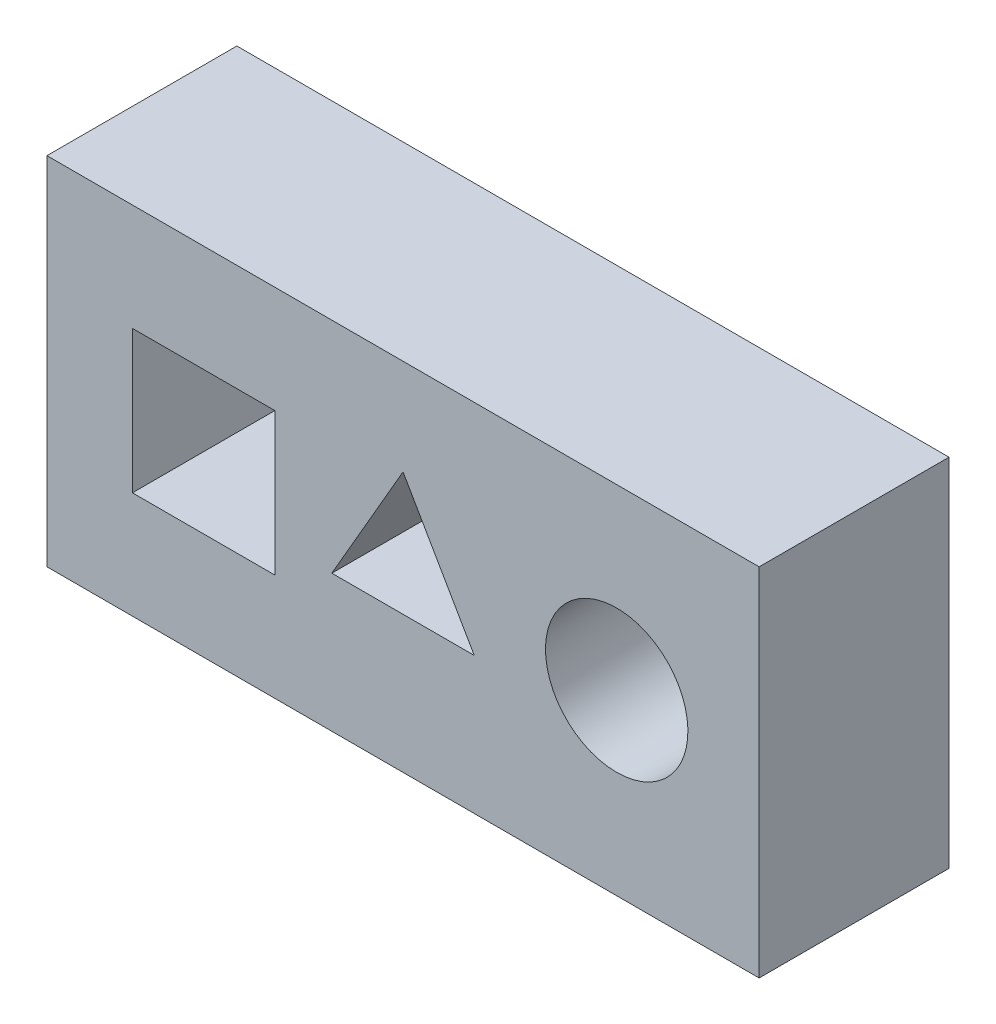
ISO-10303-21;
HEADER;
FILE_DESCRIPTION(('STEP AP214'),'2;1');
FILE_NAME('part.step','',(''),(''),'','','');
FILE_SCHEMA(('AUTOMOTIVE_DESIGN { 1 0 10303 214 1 1 1 1 }'));
ENDSEC;
DATA;
#1=APPLICATION_CONTEXT('core data for automotive mechanical design processes');
#2=APPLICATION_PROTOCOL_DEFINITION('international standard','automotive_design',2000,#1);
#3=PRODUCT_CONTEXT('',#1,'mechanical');
#4=PRODUCT('Part','Part','',(#3));
#5=PRODUCT_RELATED_PRODUCT_CATEGORY('part','',(#4));
#6=PRODUCT_DEFINITION_FORMATION('','',#4);
#7=PRODUCT_DEFINITION_CONTEXT('part definition',#1,'design');
#8=PRODUCT_DEFINITION('design','',#6,#7);
#9=PRODUCT_DEFINITION_SHAPE('','',#8);
#10=(LENGTH_UNIT() NAMED_UNIT(*) SI_UNIT(.MILLI.,.METRE.));
#11=(NAMED_UNIT(*) PLANE_ANGLE_UNIT() SI_UNIT($,.RADIAN.));
#12=(NAMED_UNIT(*) SI_UNIT($,.STERADIAN.) SOLID_ANGLE_UNIT());
#13=UNCERTAINTY_MEASURE_WITH_UNIT(LENGTH_MEASURE(1.E-05),#10,'distance_accuracy_value','');
#14=(GEOMETRIC_REPRESENTATION_CONTEXT(3) GLOBAL_UNCERTAINTY_ASSIGNED_CONTEXT((#13)) GLOBAL_UNIT_ASSIGNED_CONTEXT((#10,
#11,#12)) REPRESENTATION_CONTEXT('',''));
#15=CARTESIAN_POINT('',(0.,0.,0.));
#16=DIRECTION('',(0.,0.,1.));
#17=DIRECTION('',(1.,0.,0.));
#18=AXIS2_PLACEMENT_3D('',#15,#16,#17);
#19=CARTESIAN_POINT('',(-0.215825347615458,0.,90.));
#20=DIRECTION('',(0.,0.,1.));
#21=DIRECTION('',(1.,0.,0.));
#22=AXIS2_PLACEMENT_3D('',#19,#20,#21);
#23=PLANE('',#22);
#24=DIRECTION('',(0.,-1.,0.));
#25=VECTOR('',#24,1.);
#26=CARTESIAN_POINT('',(-150.215825347616,-75.,90.));
#27=LINE('',#26,#25);
#28=CARTESIAN_POINT('',(-150.215825347616,75.,90.));
#29=VERTEX_POINT('',#28);
#30=CARTESIAN_POINT('',(-150.215825347616,-75.,90.));
#31=VERTEX_POINT('',#30);
#32=EDGE_CURVE('E169',#29,#31,#27,.T.);
#33=ORIENTED_EDGE('',*,*,#32,.T.);
#34=DIRECTION('',(1.,0.,0.));
#35=VECTOR('',#34,1.);
#36=CARTESIAN_POINT('',(149.784174652385,-75.,90.));
#37=LINE('',#36,#35);
#38=CARTESIAN_POINT('',(149.784174652385,-75.,90.));
#39=VERTEX_POINT('',#38);
#40=EDGE_CURVE('E212',#31,#39,#37,.T.);
#41=ORIENTED_EDGE('',*,*,#40,.T.);
#42=DIRECTION('',(0.,1.,0.));
#43=VECTOR('',#42,1.);
#44=CARTESIAN_POINT('',(149.784174652385,-75.,90.));
#45=LINE('',#44,#43);
#46=CARTESIAN_POINT('',(149.784174652385,75.,90.));
#47=VERTEX_POINT('',#46);
#48=EDGE_CURVE('E210',#39,#47,#45,.T.);
#49=ORIENTED_EDGE('',*,*,#48,.T.);
#50=DIRECTION('',(-1.,0.,0.));
#51=VECTOR('',#50,1.);
#52=CARTESIAN_POINT('',(149.784174652385,75.,90.));
#53=LINE('',#52,#51);
#54=EDGE_CURVE('E59',#47,#29,#53,.T.);
#55=ORIENTED_EDGE('',*,*,#54,.T.);
#56=EDGE_LOOP('',(#33,#41,#49,#55));
#57=FACE_BOUND('',#56,.T.);
#58=CARTESIAN_POINT('',(89.7841746523844,0.,90.));
#59=DIRECTION('',(0.,0.,1.));
#60=DIRECTION('',(1.,0.,0.));
#61=AXIS2_PLACEMENT_3D('',#58,#59,#60);
#62=CIRCLE('',#61,30.);
#63=CARTESIAN_POINT('',(89.7841746523844,-29.9999999999998,90.));
#64=VERTEX_POINT('',#63);
#65=EDGE_CURVE('E186',#64,#64,#62,.T.);
#66=ORIENTED_EDGE('',*,*,#65,.F.);
#67=EDGE_LOOP('',(#66));
#68=FACE_BOUND('',#67,.T.);
#69=DIRECTION('',(1.,0.,0.));
#70=VECTOR('',#69,1.);
#71=CARTESIAN_POINT('',(-0.215825347615458,30.,90.));
#72=LINE('',#71,#70);
#73=CARTESIAN_POINT('',(-114.215825347615,30.,90.));
#74=VERTEX_POINT('',#73);
#75=CARTESIAN_POINT('',(-54.2158253476154,30.,90.));
#76=VERTEX_POINT('',#75);
#77=EDGE_CURVE('E200',#74,#76,#72,.T.);
#78=ORIENTED_EDGE('',*,*,#77,.T.);
#79=DIRECTION('',(0.,-1.,0.));
#80=VECTOR('',#79,1.);
#81=CARTESIAN_POINT('',(-54.2158253476154,0.,90.));
#82=LINE('',#81,#80);
#83=CARTESIAN_POINT('',(-54.2158253476154,-30.,90.));
#84=VERTEX_POINT('',#83);
#85=EDGE_CURVE('E136',#76,#84,#82,.T.);
#86=ORIENTED_EDGE('',*,*,#85,.T.);
#87=DIRECTION('',(1.,0.,0.));
#88=VECTOR('',#87,1.);
#89=CARTESIAN_POINT('',(-0.215825347615458,-30.,90.));
#90=LINE('',#89,#88);
#91=CARTESIAN_POINT('',(-114.215825347615,-30.,90.));
#92=VERTEX_POINT('',#91);
#93=EDGE_CURVE('E123',#92,#84,#90,.T.);
#94=ORIENTED_EDGE('',*,*,#93,.F.);
#95=DIRECTION('',(0.,-1.,0.));
#96=VECTOR('',#95,1.);
#97=CARTESIAN_POINT('',(-114.215825347615,0.,90.));
#98=LINE('',#97,#96);
#99=EDGE_CURVE('E133',#74,#92,#98,.T.);
#100=ORIENTED_EDGE('',*,*,#99,.F.);
#101=EDGE_LOOP('',(#78,#86,#94,#100));
#102=FACE_BOUND('',#101,.T.);
#103=DIRECTION('',(0.5,-0.866025403784439,0.));
#104=VECTOR('',#103,1.);
#105=CARTESIAN_POINT('',(14.7841746523845,8.66025403784438,90.));
#106=LINE('',#105,#104);
#107=CARTESIAN_POINT('',(-0.215825347615469,34.6410161513775,90.));
#108=VERTEX_POINT('',#107);
#109=CARTESIAN_POINT('',(29.7841746523845,-17.3205080756888,90.));
#110=VERTEX_POINT('',#109);
#111=EDGE_CURVE('E148',#108,#110,#106,.T.);
#112=ORIENTED_EDGE('',*,*,#111,.T.);
#113=DIRECTION('',(-1.,0.,0.));
#114=VECTOR('',#113,1.);
#115=CARTESIAN_POINT('',(-0.215825347615456,-17.3205080756888,90.));
#116=LINE('',#115,#114);
#117=CARTESIAN_POINT('',(-30.2158253476155,-17.3205080756888,90.));
#118=VERTEX_POINT('',#117);
#119=EDGE_CURVE('E151',#110,#118,#116,.T.);
#120=ORIENTED_EDGE('',*,*,#119,.T.);
#121=DIRECTION('',(0.5,0.866025403784439,0.));
#122=VECTOR('',#121,1.);
#123=CARTESIAN_POINT('',(-15.2158253476155,8.66025403784439,90.));
#124=LINE('',#123,#122);
#125=EDGE_CURVE('E154',#118,#108,#124,.T.);
#126=ORIENTED_EDGE('',*,*,#125,.T.);
#127=EDGE_LOOP('',(#112,#120,#126));
#128=FACE_BOUND('',#127,.T.);
#129=ADVANCED_FACE('F40',(#57,#68,#102,#128),#23,.T.);
#130=CARTESIAN_POINT('',(-0.215825347615458,0.,9.99999999999999));
#131=DIRECTION('',(0.,0.,1.));
#132=DIRECTION('',(1.,0.,0.));
#133=AXIS2_PLACEMENT_3D('',#130,#131,#132);
#134=PLANE('',#133);
#135=DIRECTION('',(0.,-1.,0.));
#136=VECTOR('',#135,1.);
#137=CARTESIAN_POINT('',(-150.215825347616,-75.,9.99999999999999));
#138=LINE('',#137,#136);
#139=CARTESIAN_POINT('',(-150.215825347616,75.,9.99999999999999));
#140=VERTEX_POINT('',#139);
#141=CARTESIAN_POINT('',(-150.215825347616,-75.,9.99999999999999));
#142=VERTEX_POINT('',#141);
#143=EDGE_CURVE('E158',#140,#142,#138,.T.);
#144=ORIENTED_EDGE('',*,*,#143,.F.);
#145=DIRECTION('',(-1.,0.,0.));
#146=VECTOR('',#145,1.);
#147=CARTESIAN_POINT('',(149.784174652385,75.,9.99999999999999));
#148=LINE('',#147,#146);
#149=CARTESIAN_POINT('',(149.784174652385,75.,9.99999999999999));
#150=VERTEX_POINT('',#149);
#151=EDGE_CURVE('E167',#150,#140,#148,.T.);
#152=ORIENTED_EDGE('',*,*,#151,.F.);
#153=DIRECTION('',(0.,1.,0.));
#154=VECTOR('',#153,1.);
#155=CARTESIAN_POINT('',(149.784174652385,-75.,9.99999999999999));
#156=LINE('',#155,#154);
#157=CARTESIAN_POINT('',(149.784174652385,-75.,9.99999999999999));
#158=VERTEX_POINT('',#157);
#159=EDGE_CURVE('E170',#158,#150,#156,.T.);
#160=ORIENTED_EDGE('',*,*,#159,.F.);
#161=DIRECTION('',(1.,0.,0.));
#162=VECTOR('',#161,1.);
#163=CARTESIAN_POINT('',(149.784174652385,-75.,9.99999999999999));
#164=LINE('',#163,#162);
#165=EDGE_CURVE('E160',#142,#158,#164,.T.);
#166=ORIENTED_EDGE('',*,*,#165,.F.);
#167=EDGE_LOOP('',(#144,#152,#160,#166));
#168=FACE_BOUND('',#167,.T.);
#169=DIRECTION('',(-0.5,0.866025403784439,0.));
#170=VECTOR('',#169,1.);
#171=CARTESIAN_POINT('',(14.7841746523845,8.66025403784438,9.99999999999999));
#172=LINE('',#171,#170);
#173=CARTESIAN_POINT('',(29.7841746523845,-17.3205080756888,9.99999999999999));
#174=VERTEX_POINT('',#173);
#175=CARTESIAN_POINT('',(-0.215825347615466,34.6410161513775,9.99999999999999));
#176=VERTEX_POINT('',#175);
#177=EDGE_CURVE('E157',#174,#176,#172,.T.);
#178=ORIENTED_EDGE('',*,*,#177,.T.);
#179=DIRECTION('',(-0.5,-0.866025403784439,0.));
#180=VECTOR('',#179,1.);
#181=CARTESIAN_POINT('',(-15.2158253476155,8.66025403784439,9.99999999999999));
#182=LINE('',#181,#180);
#183=CARTESIAN_POINT('',(-30.2158253476155,-17.3205080756888,9.99999999999991));
#184=VERTEX_POINT('',#183);
#185=EDGE_CURVE('E174',#176,#184,#182,.T.);
#186=ORIENTED_EDGE('',*,*,#185,.T.);
#187=DIRECTION('',(1.,0.,0.));
#188=VECTOR('',#187,1.);
#189=CARTESIAN_POINT('',(-0.215825347615456,-17.3205080756888,9.99999999999999));
#190=LINE('',#189,#188);
#191=EDGE_CURVE('E176',#184,#174,#190,.T.);
#192=ORIENTED_EDGE('',*,*,#191,.T.);
#193=EDGE_LOOP('',(#178,#186,#192));
#194=FACE_BOUND('',#193,.T.);
#195=DIRECTION('',(-1.,0.,0.));
#196=VECTOR('',#195,1.);
#197=CARTESIAN_POINT('',(-0.215825347615458,30.,9.99999999999999));
#198=LINE('',#197,#196);
#199=CARTESIAN_POINT('',(-54.2158253476154,30.,9.99999999999999));
#200=VERTEX_POINT('',#199);
#201=CARTESIAN_POINT('',(-114.215825347615,30.,9.99999999999999));
#202=VERTEX_POINT('',#201);
#203=EDGE_CURVE('E178',#200,#202,#198,.T.);
#204=ORIENTED_EDGE('',*,*,#203,.T.);
#205=DIRECTION('',(0.,1.,0.));
#206=VECTOR('',#205,1.);
#207=CARTESIAN_POINT('',(-114.215825347615,0.,9.99999999999999));
#208=LINE('',#207,#206);
#209=CARTESIAN_POINT('',(-114.215825347615,-30.,9.99999999999999));
#210=VERTEX_POINT('',#209);
#211=EDGE_CURVE('E144',#210,#202,#208,.T.);
#212=ORIENTED_EDGE('',*,*,#211,.F.);
#213=DIRECTION('',(-1.,0.,0.));
#214=VECTOR('',#213,1.);
#215=CARTESIAN_POINT('',(-0.215825347615458,-30.,9.99999999999999));
#216=LINE('',#215,#214);
#217=CARTESIAN_POINT('',(-54.2158253476154,-30.,9.99999999999991));
#218=VERTEX_POINT('',#217);
#219=EDGE_CURVE('E125',#218,#210,#216,.T.);
#220=ORIENTED_EDGE('',*,*,#219,.F.);
#221=DIRECTION('',(0.,1.,0.));
#222=VECTOR('',#221,1.);
#223=CARTESIAN_POINT('',(-54.2158253476154,0.,9.99999999999999));
#224=LINE('',#223,#222);
#225=EDGE_CURVE('E161',#218,#200,#224,.T.);
#226=ORIENTED_EDGE('',*,*,#225,.T.);
#227=EDGE_LOOP('',(#204,#212,#220,#226));
#228=FACE_BOUND('',#227,.T.);
#229=CARTESIAN_POINT('',(89.7841746523844,0.,9.99999999999999));
#230=DIRECTION('',(0.,0.,-1.));
#231=DIRECTION('',(-1.,0.,0.));
#232=AXIS2_PLACEMENT_3D('',#229,#230,#231);
#233=CIRCLE('',#232,30.);
#234=CARTESIAN_POINT('',(89.7841746523844,-29.9999999999999,10.));
#235=VERTEX_POINT('',#234);
#236=EDGE_CURVE('E183',#235,#235,#233,.T.);
#237=ORIENTED_EDGE('',*,*,#236,.F.);
#238=EDGE_LOOP('',(#237));
#239=FACE_BOUND('',#238,.T.);
#240=ADVANCED_FACE('F235',(#168,#194,#228,#239),#134,.F.);
#241=CARTESIAN_POINT('',(-150.215825347616,-75.,90.));
#242=DIRECTION('',(1.,0.,0.));
#243=DIRECTION('',(0.,0.,-1.));
#244=AXIS2_PLACEMENT_3D('',#241,#242,#243);
#245=PLANE('',#244);
#246=ORIENTED_EDGE('',*,*,#143,.T.);
#247=DIRECTION('',(0.,0.,-1.));
#248=VECTOR('',#247,1.);
#249=CARTESIAN_POINT('',(-150.215825347616,-75.,90.));
#250=LINE('',#249,#248);
#251=EDGE_CURVE('E11',#31,#142,#250,.T.);
#252=ORIENTED_EDGE('',*,*,#251,.F.);
#253=ORIENTED_EDGE('',*,*,#32,.F.);
#254=DIRECTION('',(0.,0.,-1.));
#255=VECTOR('',#254,1.);
#256=CARTESIAN_POINT('',(-150.215825347616,75.,90.));
#257=LINE('',#256,#255);
#258=EDGE_CURVE('E163',#29,#140,#257,.T.);
#259=ORIENTED_EDGE('',*,*,#258,.T.);
#260=EDGE_LOOP('',(#246,#252,#253,#259));
#261=FACE_BOUND('',#260,.T.);
#262=ADVANCED_FACE('F221',(#261),#245,.F.);
#263=CARTESIAN_POINT('',(149.784174652385,-75.,90.));
#264=DIRECTION('',(0.,1.,0.));
#265=DIRECTION('',(-1.,0.,0.));
#266=AXIS2_PLACEMENT_3D('',#263,#264,#265);
#267=PLANE('',#266);
#268=ORIENTED_EDGE('',*,*,#165,.T.);
#269=DIRECTION('',(0.,0.,-1.));
#270=VECTOR('',#269,1.);
#271=CARTESIAN_POINT('',(149.784174652385,-75.,90.));
#272=LINE('',#271,#270);
#273=EDGE_CURVE('E50',#39,#158,#272,.T.);
#274=ORIENTED_EDGE('',*,*,#273,.F.);
#275=ORIENTED_EDGE('',*,*,#40,.F.);
#276=ORIENTED_EDGE('',*,*,#251,.T.);
#277=EDGE_LOOP('',(#268,#274,#275,#276));
#278=FACE_BOUND('',#277,.T.);
#279=ADVANCED_FACE('F224',(#278),#267,.F.);
#280=CARTESIAN_POINT('',(149.784174652385,-75.,90.));
#281=DIRECTION('',(-1.,0.,0.));
#282=DIRECTION('',(0.,0.,1.));
#283=AXIS2_PLACEMENT_3D('',#280,#281,#282);
#284=PLANE('',#283);
#285=ORIENTED_EDGE('',*,*,#159,.T.);
#286=DIRECTION('',(0.,0.,-1.));
#287=VECTOR('',#286,1.);
#288=CARTESIAN_POINT('',(149.784174652385,75.,90.));
#289=LINE('',#288,#287);
#290=EDGE_CURVE('E166',#47,#150,#289,.T.);
#291=ORIENTED_EDGE('',*,*,#290,.F.);
#292=ORIENTED_EDGE('',*,*,#48,.F.);
#293=ORIENTED_EDGE('',*,*,#273,.T.);
#294=EDGE_LOOP('',(#285,#291,#292,#293));
#295=FACE_BOUND('',#294,.T.);
#296=ADVANCED_FACE('F230',(#295),#284,.F.);
#297=CARTESIAN_POINT('',(149.784174652385,75.,90.));
#298=DIRECTION('',(0.,-1.,0.));
#299=DIRECTION('',(1.,0.,0.));
#300=AXIS2_PLACEMENT_3D('',#297,#298,#299);
#301=PLANE('',#300);
#302=ORIENTED_EDGE('',*,*,#151,.T.);
#303=ORIENTED_EDGE('',*,*,#258,.F.);
#304=ORIENTED_EDGE('',*,*,#54,.F.);
#305=ORIENTED_EDGE('',*,*,#290,.T.);
#306=EDGE_LOOP('',(#302,#303,#304,#305));
#307=FACE_BOUND('',#306,.T.);
#308=ADVANCED_FACE('F233',(#307),#301,.F.);
#309=CARTESIAN_POINT('',(14.7841746523845,8.66025403784438,-213.606797749979));
#310=DIRECTION('',(-0.866025403784439,-0.5,0.));
#311=DIRECTION('',(0.5,-0.866025403784439,0.));
#312=AXIS2_PLACEMENT_3D('',#309,#310,#311);
#313=PLANE('',#312);
#314=ORIENTED_EDGE('',*,*,#177,.F.);
#315=DIRECTION('',(0.,0.,1.));
#316=VECTOR('',#315,1.);
#317=CARTESIAN_POINT('',(29.7841746523845,-17.3205080756888,-213.606797749979));
#318=LINE('',#317,#316);
#319=EDGE_CURVE('E191',#174,#110,#318,.T.);
#320=ORIENTED_EDGE('',*,*,#319,.T.);
#321=ORIENTED_EDGE('',*,*,#111,.F.);
#322=DIRECTION('',(0.,0.,1.));
#323=VECTOR('',#322,1.);
#324=CARTESIAN_POINT('',(-0.215825347615469,34.6410161513775,-213.606797749979));
#325=LINE('',#324,#323);
#326=EDGE_CURVE('E193',#176,#108,#325,.T.);
#327=ORIENTED_EDGE('',*,*,#326,.F.);
#328=EDGE_LOOP('',(#314,#320,#321,#327));
#329=FACE_BOUND('',#328,.T.);
#330=ADVANCED_FACE('F261',(#329),#313,.T.);
#331=CARTESIAN_POINT('',(-15.2158253476155,8.66025403784439,-213.606797749979));
#332=DIRECTION('',(0.866025403784439,-0.5,0.));
#333=DIRECTION('',(0.5,0.866025403784439,0.));
#334=AXIS2_PLACEMENT_3D('',#331,#332,#333);
#335=PLANE('',#334);
#336=ORIENTED_EDGE('',*,*,#185,.F.);
#337=ORIENTED_EDGE('',*,*,#326,.T.);
#338=ORIENTED_EDGE('',*,*,#125,.F.);
#339=DIRECTION('',(0.,0.,1.));
#340=VECTOR('',#339,1.);
#341=CARTESIAN_POINT('',(-30.2158253476155,-17.3205080756888,-213.606797749979));
#342=LINE('',#341,#340);
#343=EDGE_CURVE('E137',#184,#118,#342,.T.);
#344=ORIENTED_EDGE('',*,*,#343,.F.);
#345=EDGE_LOOP('',(#336,#337,#338,#344));
#346=FACE_BOUND('',#345,.T.);
#347=ADVANCED_FACE('F264',(#346),#335,.T.);
#348=CARTESIAN_POINT('',(-0.215825347615458,30.,-213.606797749979));
#349=DIRECTION('',(0.,-1.,0.));
#350=DIRECTION('',(0.,0.,-1.));
#351=AXIS2_PLACEMENT_3D('',#348,#349,#350);
#352=PLANE('',#351);
#353=ORIENTED_EDGE('',*,*,#203,.F.);
#354=DIRECTION('',(0.,0.,1.));
#355=VECTOR('',#354,1.);
#356=CARTESIAN_POINT('',(-54.2158253476154,30.,-213.606797749979));
#357=LINE('',#356,#355);
#358=EDGE_CURVE('E180',#200,#76,#357,.T.);
#359=ORIENTED_EDGE('',*,*,#358,.T.);
#360=ORIENTED_EDGE('',*,*,#77,.F.);
#361=DIRECTION('',(0.,0.,1.));
#362=VECTOR('',#361,1.);
#363=CARTESIAN_POINT('',(-114.215825347615,30.,-213.606797749979));
#364=LINE('',#363,#362);
#365=EDGE_CURVE('E141',#202,#74,#364,.T.);
#366=ORIENTED_EDGE('',*,*,#365,.F.);
#367=EDGE_LOOP('',(#353,#359,#360,#366));
#368=FACE_BOUND('',#367,.T.);
#369=ADVANCED_FACE('F199',(#368),#352,.T.);
#370=CARTESIAN_POINT('',(-114.215825347615,0.,-213.606797749979));
#371=DIRECTION('',(-1.,0.,0.));
#372=DIRECTION('',(0.,0.,1.));
#373=AXIS2_PLACEMENT_3D('',#370,#371,#372);
#374=PLANE('',#373);
#375=DIRECTION('',(0.,0.,1.));
#376=VECTOR('',#375,1.);
#377=CARTESIAN_POINT('',(-114.215825347615,-30.,-213.606797749979));
#378=LINE('',#377,#376);
#379=EDGE_CURVE('E119',#210,#92,#378,.T.);
#380=ORIENTED_EDGE('',*,*,#379,.F.);
#381=ORIENTED_EDGE('',*,*,#211,.T.);
#382=ORIENTED_EDGE('',*,*,#365,.T.);
#383=ORIENTED_EDGE('',*,*,#99,.T.);
#384=EDGE_LOOP('',(#380,#381,#382,#383));
#385=FACE_BOUND('',#384,.T.);
#386=ADVANCED_FACE('F139',(#385),#374,.F.);
#387=CARTESIAN_POINT('',(-0.215825347615458,-30.,-213.606797749979));
#388=DIRECTION('',(0.,-1.,0.));
#389=DIRECTION('',(0.,0.,-1.));
#390=AXIS2_PLACEMENT_3D('',#387,#388,#389);
#391=PLANE('',#390);
#392=DIRECTION('',(0.,0.,1.));
#393=VECTOR('',#392,1.);
#394=CARTESIAN_POINT('',(-54.2158253476154,-30.,-213.606797749979));
#395=LINE('',#394,#393);
#396=EDGE_CURVE('E44',#218,#84,#395,.T.);
#397=ORIENTED_EDGE('',*,*,#396,.F.);
#398=ORIENTED_EDGE('',*,*,#219,.T.);
#399=ORIENTED_EDGE('',*,*,#379,.T.);
#400=ORIENTED_EDGE('',*,*,#93,.T.);
#401=EDGE_LOOP('',(#397,#398,#399,#400));
#402=FACE_BOUND('',#401,.T.);
#403=ADVANCED_FACE('F122',(#402),#391,.F.);
#404=CARTESIAN_POINT('',(-0.215825347615456,-17.3205080756888,-213.606797749979));
#405=DIRECTION('',(0.,1.,0.));
#406=DIRECTION('',(-1.,0.,0.));
#407=AXIS2_PLACEMENT_3D('',#404,#405,#406);
#408=PLANE('',#407);
#409=ORIENTED_EDGE('',*,*,#191,.F.);
#410=ORIENTED_EDGE('',*,*,#343,.T.);
#411=ORIENTED_EDGE('',*,*,#119,.F.);
#412=ORIENTED_EDGE('',*,*,#319,.F.);
#413=EDGE_LOOP('',(#409,#410,#411,#412));
#414=FACE_BOUND('',#413,.T.);
#415=ADVANCED_FACE('F275',(#414),#408,.T.);
#416=CARTESIAN_POINT('',(-54.2158253476154,0.,-213.606797749979));
#417=DIRECTION('',(-1.,0.,0.));
#418=DIRECTION('',(0.,-1.,0.));
#419=AXIS2_PLACEMENT_3D('',#416,#417,#418);
#420=PLANE('',#419);
#421=ORIENTED_EDGE('',*,*,#225,.F.);
#422=ORIENTED_EDGE('',*,*,#396,.T.);
#423=ORIENTED_EDGE('',*,*,#85,.F.);
#424=ORIENTED_EDGE('',*,*,#358,.F.);
#425=EDGE_LOOP('',(#421,#422,#423,#424));
#426=FACE_BOUND('',#425,.T.);
#427=ADVANCED_FACE('F204',(#426),#420,.T.);
#428=CARTESIAN_POINT('',(89.7841746523844,0.,-213.606797749979));
#429=DIRECTION('',(0.,0.,1.));
#430=DIRECTION('',(0.,-1.,0.));
#431=AXIS2_PLACEMENT_3D('',#428,#429,#430);
#432=CYLINDRICAL_SURFACE('',#431,30.);
#433=CARTESIAN_POINT('',(89.7841746523844,-29.9999999999999,10.));
#434=CARTESIAN_POINT('',(89.7841746523844,-29.9999999999999,10.8333333333333));
#435=CARTESIAN_POINT('',(89.7841746523844,-29.9999999999999,11.6666666666667));
#436=CARTESIAN_POINT('',(89.7841746523844,-29.9999999999999,13.3333333333333));
#437=CARTESIAN_POINT('',(89.7841746523844,-29.9999999999999,14.1666666666667));
#438=CARTESIAN_POINT('',(89.7841746523844,-29.9999999999999,15.8333333333333));
#439=CARTESIAN_POINT('',(89.7841746523844,-29.9999999999999,16.6666666666667));
#440=CARTESIAN_POINT('',(89.7841746523844,-29.9999999999999,18.3333333333333));
#441=CARTESIAN_POINT('',(89.7841746523844,-29.9999999999999,19.1666666666667));
#442=CARTESIAN_POINT('',(89.7841746523844,-29.9999999999999,20.8333333333334));
#443=CARTESIAN_POINT('',(89.7841746523844,-29.9999999999999,21.6666666666667));
#444=CARTESIAN_POINT('',(89.7841746523844,-29.9999999999999,23.3333333333334));
#445=CARTESIAN_POINT('',(89.7841746523844,-29.9999999999999,24.1666666666667));
#446=CARTESIAN_POINT('',(89.7841746523844,-29.9999999999999,25.8333333333334));
#447=CARTESIAN_POINT('',(89.7841746523844,-29.9999999999999,26.6666666666667));
#448=CARTESIAN_POINT('',(89.7841746523844,-29.9999999999999,28.3333333333334));
#449=CARTESIAN_POINT('',(89.7841746523844,-29.9999999999999,29.1666666666667));
#450=CARTESIAN_POINT('',(89.7841746523844,-29.9999999999999,30.8333333333334));
#451=CARTESIAN_POINT('',(89.7841746523844,-29.9999999999999,31.6666666666667));
#452=CARTESIAN_POINT('',(89.7841746523844,-29.9999999999999,33.3333333333334));
#453=CARTESIAN_POINT('',(89.7841746523844,-29.9999999999999,34.1666666666667));
#454=CARTESIAN_POINT('',(89.7841746523844,-29.9999999999999,35.8333333333333));
#455=CARTESIAN_POINT('',(89.7841746523844,-29.9999999999999,36.6666666666667));
#456=CARTESIAN_POINT('',(89.7841746523844,-29.9999999999999,38.3333333333333));
#457=CARTESIAN_POINT('',(89.7841746523844,-29.9999999999999,39.1666666666667));
#458=CARTESIAN_POINT('',(89.7841746523844,-29.9999999999999,40.8333333333333));
#459=CARTESIAN_POINT('',(89.7841746523844,-29.9999999999999,41.6666666666667));
#460=CARTESIAN_POINT('',(89.7841746523844,-29.9999999999999,43.3333333333333));
#461=CARTESIAN_POINT('',(89.7841746523844,-29.9999999999999,44.1666666666666));
#462=CARTESIAN_POINT('',(89.7841746523844,-29.9999999999999,45.8333333333333));
#463=CARTESIAN_POINT('',(89.7841746523844,-29.9999999999999,46.6666666666667));
#464=CARTESIAN_POINT('',(89.7841746523844,-29.9999999999999,48.3333333333333));
#465=CARTESIAN_POINT('',(89.7841746523844,-29.9999999999999,49.1666666666666));
#466=CARTESIAN_POINT('',(89.7841746523844,-29.9999999999999,50.8333333333333));
#467=CARTESIAN_POINT('',(89.7841746523844,-29.9999999999999,51.6666666666667));
#468=CARTESIAN_POINT('',(89.7841746523844,-29.9999999999999,53.3333333333333));
#469=CARTESIAN_POINT('',(89.7841746523844,-29.9999999999999,54.1666666666667));
#470=CARTESIAN_POINT('',(89.7841746523844,-29.9999999999999,55.8333333333333));
#471=CARTESIAN_POINT('',(89.7841746523844,-29.9999999999999,56.6666666666666));
#472=CARTESIAN_POINT('',(89.7841746523844,-29.9999999999999,58.3333333333333));
#473=CARTESIAN_POINT('',(89.7841746523844,-29.9999999999999,59.1666666666666));
#474=CARTESIAN_POINT('',(89.7841746523844,-29.9999999999999,60.8333333333333));
#475=CARTESIAN_POINT('',(89.7841746523844,-29.9999999999999,61.6666666666666));
#476=CARTESIAN_POINT('',(89.7841746523844,-29.9999999999999,63.3333333333333));
#477=CARTESIAN_POINT('',(89.7841746523844,-29.9999999999999,64.1666666666666));
#478=CARTESIAN_POINT('',(89.7841746523844,-29.9999999999999,65.8333333333333));
#479=CARTESIAN_POINT('',(89.7841746523844,-29.9999999999999,66.6666666666666));
#480=CARTESIAN_POINT('',(89.7841746523844,-29.9999999999999,68.3333333333333));
#481=CARTESIAN_POINT('',(89.7841746523844,-29.9999999999999,69.1666666666666));
#482=CARTESIAN_POINT('',(89.7841746523844,-29.9999999999999,70.8333333333333));
#483=CARTESIAN_POINT('',(89.7841746523844,-29.9999999999999,71.6666666666666));
#484=CARTESIAN_POINT('',(89.7841746523844,-29.9999999999999,73.3333333333333));
#485=CARTESIAN_POINT('',(89.7841746523844,-29.9999999999999,74.1666666666666));
#486=CARTESIAN_POINT('',(89.7841746523844,-29.9999999999999,75.8333333333333));
#487=CARTESIAN_POINT('',(89.7841746523844,-29.9999999999998,76.6666666666666));
#488=CARTESIAN_POINT('',(89.7841746523844,-29.9999999999998,78.3333333333333));
#489=CARTESIAN_POINT('',(89.7841746523844,-29.9999999999998,79.1666666666666));
#490=CARTESIAN_POINT('',(89.7841746523844,-29.9999999999998,80.8333333333333));
#491=CARTESIAN_POINT('',(89.7841746523844,-29.9999999999998,81.6666666666667));
#492=CARTESIAN_POINT('',(89.7841746523844,-29.9999999999998,83.3333333333333));
#493=CARTESIAN_POINT('',(89.7841746523844,-29.9999999999998,84.1666666666667));
#494=CARTESIAN_POINT('',(89.7841746523844,-29.9999999999998,85.8333333333333));
#495=CARTESIAN_POINT('',(89.7841746523844,-29.9999999999998,86.6666666666667));
#496=CARTESIAN_POINT('',(89.7841746523844,-29.9999999999998,88.3333333333333));
#497=CARTESIAN_POINT('',(89.7841746523844,-29.9999999999998,89.1666666666667));
#498=CARTESIAN_POINT('',(89.7841746523844,-29.9999999999998,90.));
#499=B_SPLINE_CURVE_WITH_KNOTS('',3,(#433,#434,#435,#436,#437,#438,#439,#440,#441,#442,#443,
#444,#445,#446,#447,#448,#449,#450,#451,#452,#453,#454,#455,#456,#457,#458,#459,#460,#461,#462,
#463,#464,#465,#466,#467,#468,#469,#470,#471,#472,#473,#474,#475,#476,#477,#478,#479,#480,#481,
#482,#483,#484,#485,#486,#487,#488,#489,#490,#491,#492,#493,#494,#495,#496,#497,#498),
.UNSPECIFIED.,.F.,.F.,(4,2,2,2,2,2,2,2,2,2,2,2,2,2,2,2,2,2,2,2,2,2,2,2,2,2,2,2,2,2,2,2,4),(0.,
2.5,5.,7.50000000000001,10.,12.5,15.,17.5,20.,22.5,25.,27.5,30.,32.5,35.,37.5,40.,42.5,45.,47.5,
50.,52.5,55.,57.5,60.,62.5,65.,67.5,70.,72.5,75.,77.5,80.),.UNSPECIFIED.);
#500=EDGE_CURVE('BSEAM42',#235,#64,#499,.T.);
#501=ORIENTED_EDGE('',*,*,#236,.T.);
#502=ORIENTED_EDGE('',*,*,#65,.T.);
#503=ORIENTED_EDGE('',*,*,#500,.T.);
#504=ORIENTED_EDGE('',*,*,#500,.F.);
#505=EDGE_LOOP('',(#501,#503,#502,#504));
#506=FACE_BOUND('',#505,.T.);
#507=ADVANCED_FACE('F42',(#506),#432,.F.);
#508=CLOSED_SHELL('',(#129,#240,#262,#279,#296,#308,#330,#347,#369,#386,#403,#415,#427,#507));
#509=MANIFOLD_SOLID_BREP('B2',#508);
#510=ADVANCED_BREP_SHAPE_REPRESENTATION('',(#18,#509),#14);
#511=SHAPE_DEFINITION_REPRESENTATION(#9,#510);
ENDSEC;
END-ISO-10303-21;
